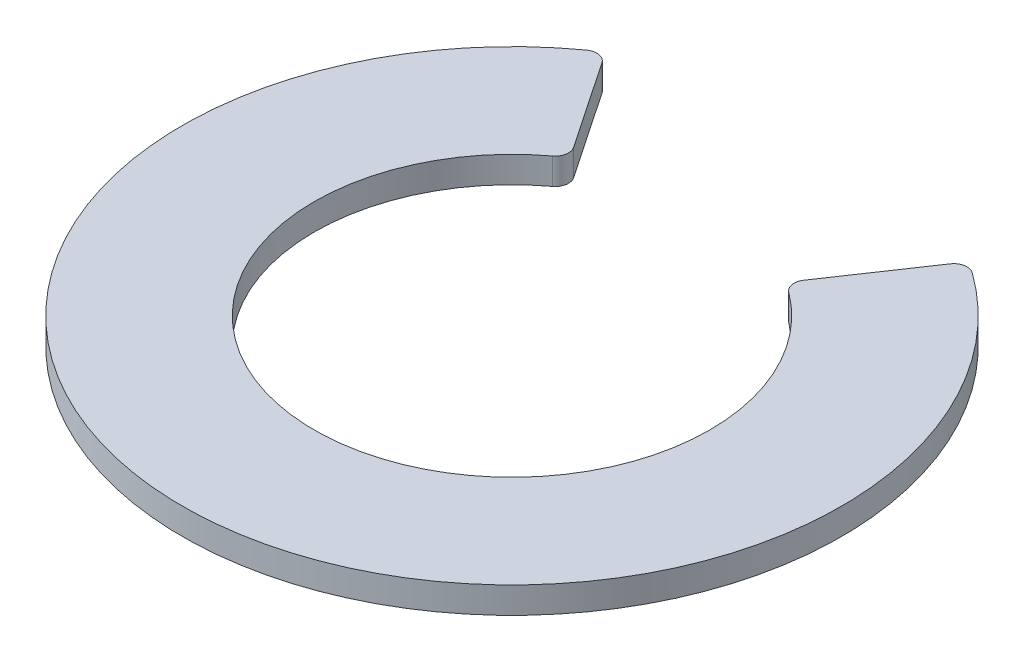
ISO-10303-21;
HEADER;
FILE_DESCRIPTION(('STEP AP214'),'2;1');
FILE_NAME('part.step','',(''),(''),'','','');
FILE_SCHEMA(('AUTOMOTIVE_DESIGN { 1 0 10303 214 1 1 1 1 }'));
ENDSEC;
DATA;
#1=APPLICATION_CONTEXT('core data for automotive mechanical design processes');
#2=APPLICATION_PROTOCOL_DEFINITION('international standard','automotive_design',2000,#1);
#3=PRODUCT_CONTEXT('',#1,'mechanical');
#4=PRODUCT('Part','Part','',(#3));
#5=PRODUCT_RELATED_PRODUCT_CATEGORY('part','',(#4));
#6=PRODUCT_DEFINITION_FORMATION('','',#4);
#7=PRODUCT_DEFINITION_CONTEXT('part definition',#1,'design');
#8=PRODUCT_DEFINITION('design','',#6,#7);
#9=PRODUCT_DEFINITION_SHAPE('','',#8);
#10=(LENGTH_UNIT() NAMED_UNIT(*) SI_UNIT(.MILLI.,.METRE.));
#11=(NAMED_UNIT(*) PLANE_ANGLE_UNIT() SI_UNIT($,.RADIAN.));
#12=(NAMED_UNIT(*) SI_UNIT($,.STERADIAN.) SOLID_ANGLE_UNIT());
#13=UNCERTAINTY_MEASURE_WITH_UNIT(LENGTH_MEASURE(1.E-05),#10,'distance_accuracy_value','');
#14=(GEOMETRIC_REPRESENTATION_CONTEXT(3) GLOBAL_UNCERTAINTY_ASSIGNED_CONTEXT((#13)) GLOBAL_UNIT_ASSIGNED_CONTEXT((#10,
#11,#12)) REPRESENTATION_CONTEXT('',''));
#15=CARTESIAN_POINT('',(0.,0.,0.));
#16=DIRECTION('',(0.,0.,1.));
#17=DIRECTION('',(1.,0.,0.));
#18=AXIS2_PLACEMENT_3D('',#15,#16,#17);
#19=CARTESIAN_POINT('',(1.40338959700864,0.2,-1.94692003919214));
#20=DIRECTION('',(0.,-1.,0.));
#21=DIRECTION('',(0.,0.,-1.));
#22=AXIS2_PLACEMENT_3D('',#19,#20,#21);
#23=CYLINDRICAL_SURFACE('',#22,0.0999999999999998);
#24=CARTESIAN_POINT('',(1.40338959700864,0.,-1.94692003919214));
#25=DIRECTION('',(0.,1.,0.));
#26=DIRECTION('',(0.,0.,1.));
#27=AXIS2_PLACEMENT_3D('',#24,#25,#26);
#28=CIRCLE('',#27,0.0999999999999998);
#29=CARTESIAN_POINT('',(1.46186416355067,0.,-2.02804170749181));
#30=VERTEX_POINT('',#29);
#31=CARTESIAN_POINT('',(1.3205171381093,0.,-2.00288570327269));
#32=VERTEX_POINT('',#31);
#33=EDGE_CURVE('E131',#30,#32,#28,.T.);
#34=ORIENTED_EDGE('',*,*,#33,.T.);
#35=DIRECTION('',(0.,-1.,0.));
#36=VECTOR('',#35,1.);
#37=CARTESIAN_POINT('',(1.3205171381093,0.2,-2.00288570327269));
#38=LINE('',#37,#36);
#39=CARTESIAN_POINT('',(1.3205171381093,0.2,-2.00288570327269));
#40=VERTEX_POINT('',#39);
#41=EDGE_CURVE('E11',#40,#32,#38,.T.);
#42=ORIENTED_EDGE('',*,*,#41,.F.);
#43=CARTESIAN_POINT('',(1.40338959700864,0.2,-1.94692003919214));
#44=DIRECTION('',(0.,1.,0.));
#45=DIRECTION('',(0.,0.,1.));
#46=AXIS2_PLACEMENT_3D('',#43,#44,#45);
#47=CIRCLE('',#46,0.0999999999999998);
#48=CARTESIAN_POINT('',(1.46186416355067,0.2,-2.02804170749181));
#49=VERTEX_POINT('',#48);
#50=EDGE_CURVE('E145',#49,#40,#47,.T.);
#51=ORIENTED_EDGE('',*,*,#50,.F.);
#52=DIRECTION('',(0.,-1.,0.));
#53=VECTOR('',#52,1.);
#54=CARTESIAN_POINT('',(1.46186416355067,0.2,-2.02804170749181));
#55=LINE('',#54,#53);
#56=EDGE_CURVE('E127',#49,#30,#55,.T.);
#57=ORIENTED_EDGE('',*,*,#56,.T.);
#58=EDGE_LOOP('',(#34,#42,#51,#57));
#59=FACE_BOUND('',#58,.T.);
#60=ADVANCED_FACE('F35',(#59),#23,.T.);
#61=CARTESIAN_POINT('',(1.3205171381093,0.2,-2.00288570327269));
#62=DIRECTION('',(0.828724588993442,0.,0.55965664080546));
#63=DIRECTION('',(0.55965664080546,0.,-0.828724588993442));
#64=AXIS2_PLACEMENT_3D('',#61,#62,#63);
#65=PLANE('',#64);
#66=DIRECTION('',(-0.55965664080546,0.,0.828724588993441));
#67=VECTOR('',#66,1.);
#68=CARTESIAN_POINT('',(1.3205171381093,0.,-2.00288570327269));
#69=LINE('',#68,#67);
#70=CARTESIAN_POINT('',(0.872477250937079,0.,-1.33944021852853));
#71=VERTEX_POINT('',#70);
#72=EDGE_CURVE('E134',#32,#71,#69,.T.);
#73=ORIENTED_EDGE('',*,*,#72,.T.);
#74=DIRECTION('',(0.,-1.,0.));
#75=VECTOR('',#74,1.);
#76=CARTESIAN_POINT('',(0.872477250937079,0.2,-1.33944021852853));
#77=LINE('',#76,#75);
#78=CARTESIAN_POINT('',(0.872477250937079,0.2,-1.33944021852853));
#79=VERTEX_POINT('',#78);
#80=EDGE_CURVE('E43',#79,#71,#77,.T.);
#81=ORIENTED_EDGE('',*,*,#80,.F.);
#82=DIRECTION('',(-0.55965664080546,0.,0.828724588993441));
#83=VECTOR('',#82,1.);
#84=CARTESIAN_POINT('',(1.3205171381093,0.2,-2.00288570327269));
#85=LINE('',#84,#83);
#86=EDGE_CURVE('E94',#40,#79,#85,.T.);
#87=ORIENTED_EDGE('',*,*,#86,.F.);
#88=ORIENTED_EDGE('',*,*,#41,.T.);
#89=EDGE_LOOP('',(#73,#81,#87,#88));
#90=FACE_BOUND('',#89,.T.);
#91=ADVANCED_FACE('F180',(#90),#65,.F.);
#92=CARTESIAN_POINT('',(0.955349709836423,0.2,-1.28347455444799));
#93=DIRECTION('',(0.,-1.,0.));
#94=DIRECTION('',(0.,0.,-1.));
#95=AXIS2_PLACEMENT_3D('',#92,#93,#94);
#96=CYLINDRICAL_SURFACE('',#95,0.1);
#97=CARTESIAN_POINT('',(0.955349709836423,0.,-1.28347455444799));
#98=DIRECTION('',(0.,1.,0.));
#99=DIRECTION('',(0.,0.,1.));
#100=AXIS2_PLACEMENT_3D('',#97,#98,#99);
#101=CIRCLE('',#100,0.1);
#102=CARTESIAN_POINT('',(0.895640352971647,0.,-1.20325739479499));
#103=VERTEX_POINT('',#102);
#104=EDGE_CURVE('E136',#71,#103,#101,.T.);
#105=ORIENTED_EDGE('',*,*,#104,.T.);
#106=DIRECTION('',(0.,-1.,0.));
#107=VECTOR('',#106,1.);
#108=CARTESIAN_POINT('',(0.895640352971647,0.2,-1.20325739479499));
#109=LINE('',#108,#107);
#110=CARTESIAN_POINT('',(0.895640352971647,0.2,-1.20325739479499));
#111=VERTEX_POINT('',#110);
#112=EDGE_CURVE('E152',#111,#103,#109,.T.);
#113=ORIENTED_EDGE('',*,*,#112,.F.);
#114=CARTESIAN_POINT('',(0.955349709836423,0.2,-1.28347455444799));
#115=DIRECTION('',(0.,1.,0.));
#116=DIRECTION('',(0.,0.,1.));
#117=AXIS2_PLACEMENT_3D('',#114,#115,#116);
#118=CIRCLE('',#117,0.1);
#119=EDGE_CURVE('E160',#79,#111,#118,.T.);
#120=ORIENTED_EDGE('',*,*,#119,.F.);
#121=ORIENTED_EDGE('',*,*,#80,.T.);
#122=EDGE_LOOP('',(#105,#113,#120,#121));
#123=FACE_BOUND('',#122,.T.);
#124=ADVANCED_FACE('F158',(#123),#96,.T.);
#125=CARTESIAN_POINT('',(0.,0.2,0.));
#126=DIRECTION('',(0.,-1.,0.));
#127=DIRECTION('',(0.,0.,-1.));
#128=AXIS2_PLACEMENT_3D('',#125,#126,#127);
#129=CYLINDRICAL_SURFACE('',#128,1.5);
#130=CARTESIAN_POINT('',(0.,0.,0.));
#131=DIRECTION('',(0.,-1.,0.));
#132=DIRECTION('',(0.,0.,1.));
#133=AXIS2_PLACEMENT_3D('',#130,#131,#132);
#134=CIRCLE('',#133,1.5);
#135=CARTESIAN_POINT('',(-0.895640352971647,0.,-1.20325739479499));
#136=VERTEX_POINT('',#135);
#137=EDGE_CURVE('E138',#103,#136,#134,.T.);
#138=ORIENTED_EDGE('',*,*,#137,.T.);
#139=DIRECTION('',(0.,-1.,0.));
#140=VECTOR('',#139,1.);
#141=CARTESIAN_POINT('',(-0.895640352971647,0.2,-1.20325739479499));
#142=LINE('',#141,#140);
#143=CARTESIAN_POINT('',(-0.895640352971647,0.2,-1.20325739479499));
#144=VERTEX_POINT('',#143);
#145=EDGE_CURVE('E149',#144,#136,#142,.T.);
#146=ORIENTED_EDGE('',*,*,#145,.F.);
#147=CARTESIAN_POINT('',(0.,0.2,0.));
#148=DIRECTION('',(0.,-1.,0.));
#149=DIRECTION('',(0.,0.,1.));
#150=AXIS2_PLACEMENT_3D('',#147,#148,#149);
#151=CIRCLE('',#150,1.5);
#152=EDGE_CURVE('E172',#111,#144,#151,.T.);
#153=ORIENTED_EDGE('',*,*,#152,.F.);
#154=ORIENTED_EDGE('',*,*,#112,.T.);
#155=EDGE_LOOP('',(#138,#146,#153,#154));
#156=FACE_BOUND('',#155,.T.);
#157=ADVANCED_FACE('F168',(#156),#129,.F.);
#158=CARTESIAN_POINT('',(-0.955349709836424,0.2,-1.28347455444799));
#159=DIRECTION('',(0.,-1.,0.));
#160=DIRECTION('',(0.,0.,-1.));
#161=AXIS2_PLACEMENT_3D('',#158,#159,#160);
#162=CYLINDRICAL_SURFACE('',#161,0.1);
#163=CARTESIAN_POINT('',(-0.955349709836424,0.,-1.28347455444799));
#164=DIRECTION('',(0.,1.,0.));
#165=DIRECTION('',(0.,0.,-1.));
#166=AXIS2_PLACEMENT_3D('',#163,#164,#165);
#167=CIRCLE('',#166,0.1);
#168=CARTESIAN_POINT('',(-0.872477250937079,0.,-1.33944021852853));
#169=VERTEX_POINT('',#168);
#170=EDGE_CURVE('E140',#136,#169,#167,.T.);
#171=ORIENTED_EDGE('',*,*,#170,.T.);
#172=DIRECTION('',(0.,-1.,0.));
#173=VECTOR('',#172,1.);
#174=CARTESIAN_POINT('',(-0.872477250937079,0.2,-1.33944021852853));
#175=LINE('',#174,#173);
#176=CARTESIAN_POINT('',(-0.872477250937079,0.2,-1.33944021852853));
#177=VERTEX_POINT('',#176);
#178=EDGE_CURVE('E122',#177,#169,#175,.T.);
#179=ORIENTED_EDGE('',*,*,#178,.F.);
#180=CARTESIAN_POINT('',(-0.955349709836424,0.2,-1.28347455444799));
#181=DIRECTION('',(0.,1.,0.));
#182=DIRECTION('',(0.,0.,-1.));
#183=AXIS2_PLACEMENT_3D('',#180,#181,#182);
#184=CIRCLE('',#183,0.1);
#185=EDGE_CURVE('E113',#144,#177,#184,.T.);
#186=ORIENTED_EDGE('',*,*,#185,.F.);
#187=ORIENTED_EDGE('',*,*,#145,.T.);
#188=EDGE_LOOP('',(#171,#179,#186,#187));
#189=FACE_BOUND('',#188,.T.);
#190=ADVANCED_FACE('F171',(#189),#162,.T.);
#191=CARTESIAN_POINT('',(-1.3205171381093,0.2,-2.00288570327269));
#192=DIRECTION('',(-0.828724588993441,0.,0.55965664080546));
#193=DIRECTION('',(0.55965664080546,0.,0.828724588993441));
#194=AXIS2_PLACEMENT_3D('',#191,#192,#193);
#195=PLANE('',#194);
#196=DIRECTION('',(-0.55965664080546,0.,-0.828724588993441));
#197=VECTOR('',#196,1.);
#198=CARTESIAN_POINT('',(-1.3205171381093,0.,-2.00288570327269));
#199=LINE('',#198,#197);
#200=CARTESIAN_POINT('',(-1.3205171381093,0.,-2.00288570327269));
#201=VERTEX_POINT('',#200);
#202=EDGE_CURVE('E121',#169,#201,#199,.T.);
#203=ORIENTED_EDGE('',*,*,#202,.T.);
#204=DIRECTION('',(0.,-1.,0.));
#205=VECTOR('',#204,1.);
#206=CARTESIAN_POINT('',(-1.3205171381093,0.2,-2.00288570327269));
#207=LINE('',#206,#205);
#208=CARTESIAN_POINT('',(-1.3205171381093,0.2,-2.00288570327269));
#209=VERTEX_POINT('',#208);
#210=EDGE_CURVE('E118',#209,#201,#207,.T.);
#211=ORIENTED_EDGE('',*,*,#210,.F.);
#212=DIRECTION('',(-0.55965664080546,0.,-0.828724588993441));
#213=VECTOR('',#212,1.);
#214=CARTESIAN_POINT('',(-1.3205171381093,0.2,-2.00288570327269));
#215=LINE('',#214,#213);
#216=EDGE_CURVE('E107',#177,#209,#215,.T.);
#217=ORIENTED_EDGE('',*,*,#216,.F.);
#218=ORIENTED_EDGE('',*,*,#178,.T.);
#219=EDGE_LOOP('',(#203,#211,#217,#218));
#220=FACE_BOUND('',#219,.T.);
#221=ADVANCED_FACE('F119',(#220),#195,.F.);
#222=CARTESIAN_POINT('',(-1.40338959700864,0.2,-1.94692003919214));
#223=DIRECTION('',(0.,-1.,0.));
#224=DIRECTION('',(0.,0.,-1.));
#225=AXIS2_PLACEMENT_3D('',#222,#223,#224);
#226=CYLINDRICAL_SURFACE('',#225,0.1);
#227=CARTESIAN_POINT('',(-1.40338959700864,0.,-1.94692003919214));
#228=DIRECTION('',(0.,1.,0.));
#229=DIRECTION('',(0.,0.,1.));
#230=AXIS2_PLACEMENT_3D('',#227,#228,#229);
#231=CIRCLE('',#230,0.1);
#232=CARTESIAN_POINT('',(-1.46186416355067,0.,-2.02804170749181));
#233=VERTEX_POINT('',#232);
#234=EDGE_CURVE('E80',#201,#233,#231,.T.);
#235=ORIENTED_EDGE('',*,*,#234,.T.);
#236=DIRECTION('',(0.,-1.,0.));
#237=VECTOR('',#236,1.);
#238=CARTESIAN_POINT('',(-1.46186416355067,0.2,-2.02804170749181));
#239=LINE('',#238,#237);
#240=CARTESIAN_POINT('',(-1.46186416355067,0.2,-2.02804170749181));
#241=VERTEX_POINT('',#240);
#242=EDGE_CURVE('E123',#241,#233,#239,.T.);
#243=ORIENTED_EDGE('',*,*,#242,.F.);
#244=CARTESIAN_POINT('',(-1.40338959700864,0.2,-1.94692003919214));
#245=DIRECTION('',(0.,1.,0.));
#246=DIRECTION('',(0.,0.,1.));
#247=AXIS2_PLACEMENT_3D('',#244,#245,#246);
#248=CIRCLE('',#247,0.1);
#249=EDGE_CURVE('E111',#209,#241,#248,.T.);
#250=ORIENTED_EDGE('',*,*,#249,.F.);
#251=ORIENTED_EDGE('',*,*,#210,.T.);
#252=EDGE_LOOP('',(#235,#243,#250,#251));
#253=FACE_BOUND('',#252,.T.);
#254=ADVANCED_FACE('F125',(#253),#226,.T.);
#255=CARTESIAN_POINT('',(0.,0.2,0.));
#256=DIRECTION('',(0.,-1.,0.));
#257=DIRECTION('',(0.,0.,-1.));
#258=AXIS2_PLACEMENT_3D('',#255,#256,#257);
#259=CYLINDRICAL_SURFACE('',#258,2.5);
#260=CARTESIAN_POINT('',(0.,0.,0.));
#261=DIRECTION('',(0.,1.,0.));
#262=DIRECTION('',(0.,0.,1.));
#263=AXIS2_PLACEMENT_3D('',#260,#261,#262);
#264=CIRCLE('',#263,2.5);
#265=EDGE_CURVE('E86',#233,#30,#264,.T.);
#266=ORIENTED_EDGE('',*,*,#265,.T.);
#267=ORIENTED_EDGE('',*,*,#56,.F.);
#268=CARTESIAN_POINT('',(0.,0.2,0.));
#269=DIRECTION('',(0.,1.,0.));
#270=DIRECTION('',(0.,0.,1.));
#271=AXIS2_PLACEMENT_3D('',#268,#269,#270);
#272=CIRCLE('',#271,2.5);
#273=EDGE_CURVE('E51',#241,#49,#272,.T.);
#274=ORIENTED_EDGE('',*,*,#273,.F.);
#275=ORIENTED_EDGE('',*,*,#242,.T.);
#276=EDGE_LOOP('',(#266,#267,#274,#275));
#277=FACE_BOUND('',#276,.T.);
#278=ADVANCED_FACE('F196',(#277),#259,.T.);
#279=CARTESIAN_POINT('',(1.40338959700864,0.2,-1.94692003919214));
#280=DIRECTION('',(0.,1.,0.));
#281=DIRECTION('',(0.,0.,1.));
#282=AXIS2_PLACEMENT_3D('',#279,#280,#281);
#283=PLANE('',#282);
#284=ORIENTED_EDGE('',*,*,#50,.T.);
#285=ORIENTED_EDGE('',*,*,#86,.T.);
#286=ORIENTED_EDGE('',*,*,#119,.T.);
#287=ORIENTED_EDGE('',*,*,#152,.T.);
#288=ORIENTED_EDGE('',*,*,#185,.T.);
#289=ORIENTED_EDGE('',*,*,#216,.T.);
#290=ORIENTED_EDGE('',*,*,#249,.T.);
#291=ORIENTED_EDGE('',*,*,#273,.T.);
#292=EDGE_LOOP('',(#284,#285,#286,#287,#288,#289,#290,#291));
#293=FACE_BOUND('',#292,.T.);
#294=ADVANCED_FACE('F109',(#293),#283,.T.);
#295=CARTESIAN_POINT('',(1.40338959700864,0.,-1.94692003919214));
#296=DIRECTION('',(0.,1.,0.));
#297=DIRECTION('',(0.,0.,1.));
#298=AXIS2_PLACEMENT_3D('',#295,#296,#297);
#299=PLANE('',#298);
#300=ORIENTED_EDGE('',*,*,#33,.F.);
#301=ORIENTED_EDGE('',*,*,#265,.F.);
#302=ORIENTED_EDGE('',*,*,#234,.F.);
#303=ORIENTED_EDGE('',*,*,#202,.F.);
#304=ORIENTED_EDGE('',*,*,#170,.F.);
#305=ORIENTED_EDGE('',*,*,#137,.F.);
#306=ORIENTED_EDGE('',*,*,#104,.F.);
#307=ORIENTED_EDGE('',*,*,#72,.F.);
#308=EDGE_LOOP('',(#300,#301,#302,#303,#304,#305,#306,#307));
#309=FACE_BOUND('',#308,.T.);
#310=ADVANCED_FACE('F164',(#309),#299,.F.);
#311=CLOSED_SHELL('',(#60,#91,#124,#157,#190,#221,#254,#278,#294,#310));
#312=MANIFOLD_SOLID_BREP('B2',#311);
#313=ADVANCED_BREP_SHAPE_REPRESENTATION('',(#18,#312),#14);
#314=SHAPE_DEFINITION_REPRESENTATION(#9,#313);
ENDSEC;
END-ISO-10303-21;
